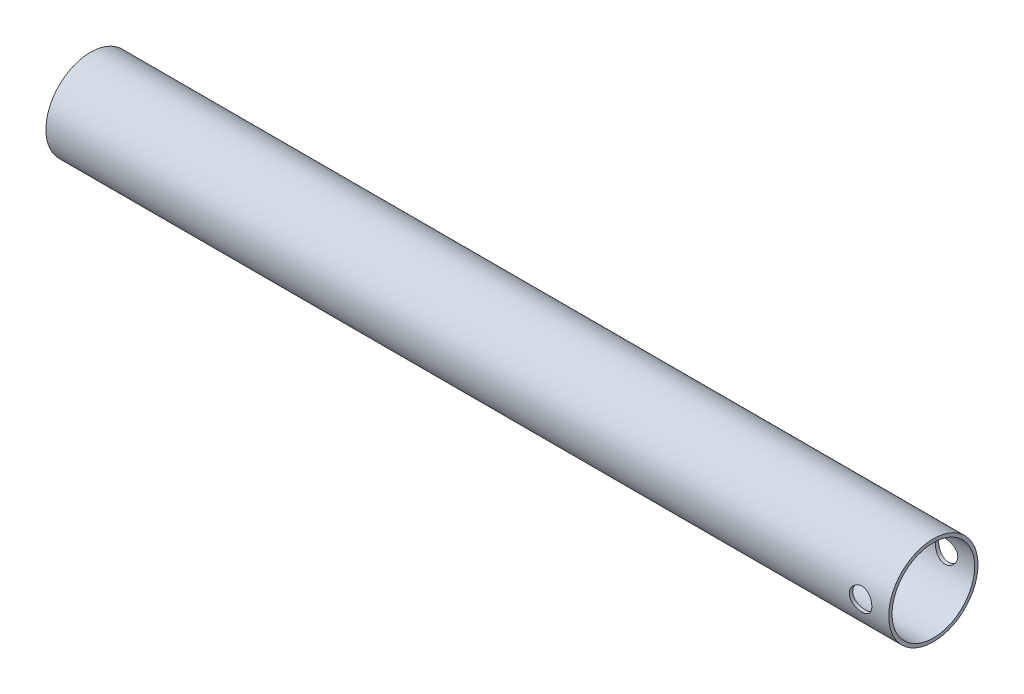
ISO-10303-21;
HEADER;
FILE_DESCRIPTION(('STEP AP214'),'2;1');
FILE_NAME('part.step','',(''),(''),'','','');
FILE_SCHEMA(('AUTOMOTIVE_DESIGN { 1 0 10303 214 1 1 1 1 }'));
ENDSEC;
DATA;
#1=APPLICATION_CONTEXT('core data for automotive mechanical design processes');
#2=APPLICATION_PROTOCOL_DEFINITION('international standard','automotive_design',2000,#1);
#3=PRODUCT_CONTEXT('',#1,'mechanical');
#4=PRODUCT('Part','Part','',(#3));
#5=PRODUCT_RELATED_PRODUCT_CATEGORY('part','',(#4));
#6=PRODUCT_DEFINITION_FORMATION('','',#4);
#7=PRODUCT_DEFINITION_CONTEXT('part definition',#1,'design');
#8=PRODUCT_DEFINITION('design','',#6,#7);
#9=PRODUCT_DEFINITION_SHAPE('','',#8);
#10=(LENGTH_UNIT() NAMED_UNIT(*) SI_UNIT(.MILLI.,.METRE.));
#11=(NAMED_UNIT(*) PLANE_ANGLE_UNIT() SI_UNIT($,.RADIAN.));
#12=(NAMED_UNIT(*) SI_UNIT($,.STERADIAN.) SOLID_ANGLE_UNIT());
#13=UNCERTAINTY_MEASURE_WITH_UNIT(LENGTH_MEASURE(1.E-05),#10,'distance_accuracy_value','');
#14=(GEOMETRIC_REPRESENTATION_CONTEXT(3) GLOBAL_UNCERTAINTY_ASSIGNED_CONTEXT((#13)) GLOBAL_UNIT_ASSIGNED_CONTEXT((#10,
#11,#12)) REPRESENTATION_CONTEXT('',''));
#15=CARTESIAN_POINT('',(0.,0.,0.));
#16=DIRECTION('',(0.,0.,1.));
#17=DIRECTION('',(1.,0.,0.));
#18=AXIS2_PLACEMENT_3D('',#15,#16,#17);
#19=CARTESIAN_POINT('',(300.,0.,0.));
#20=DIRECTION('',(1.,0.,0.));
#21=DIRECTION('',(0.,0.,-1.));
#22=AXIS2_PLACEMENT_3D('',#19,#20,#21);
#23=PLANE('',#22);
#24=CARTESIAN_POINT('',(300.,0.,0.));
#25=DIRECTION('',(1.,0.,0.));
#26=DIRECTION('',(0.,0.,-1.));
#27=AXIS2_PLACEMENT_3D('',#24,#25,#26);
#28=CIRCLE('',#27,15.9);
#29=CARTESIAN_POINT('',(300.,0.,-15.9));
#30=VERTEX_POINT('',#29);
#31=EDGE_CURVE('E10',#30,#30,#28,.T.);
#32=ORIENTED_EDGE('',*,*,#31,.T.);
#33=EDGE_LOOP('',(#32));
#34=FACE_BOUND('',#33,.T.);
#35=CARTESIAN_POINT('',(300.,0.,0.));
#36=DIRECTION('',(1.,0.,0.));
#37=DIRECTION('',(0.,0.,-1.));
#38=AXIS2_PLACEMENT_3D('',#35,#36,#37);
#39=CIRCLE('',#38,14.7);
#40=CARTESIAN_POINT('',(300.,0.,-14.7));
#41=VERTEX_POINT('',#40);
#42=EDGE_CURVE('E48',#41,#41,#39,.T.);
#43=ORIENTED_EDGE('',*,*,#42,.F.);
#44=EDGE_LOOP('',(#43));
#45=FACE_BOUND('',#44,.T.);
#46=ADVANCED_FACE('F30',(#34,#45),#23,.T.);
#47=CARTESIAN_POINT('',(0.,0.,0.));
#48=DIRECTION('',(1.,0.,0.));
#49=DIRECTION('',(0.,0.,-1.));
#50=AXIS2_PLACEMENT_3D('',#47,#48,#49);
#51=PLANE('',#50);
#52=CARTESIAN_POINT('',(0.,0.,0.));
#53=DIRECTION('',(1.,0.,0.));
#54=DIRECTION('',(0.,0.,-1.));
#55=AXIS2_PLACEMENT_3D('',#52,#53,#54);
#56=CIRCLE('',#55,15.9);
#57=CARTESIAN_POINT('',(0.,0.,-15.9));
#58=VERTEX_POINT('',#57);
#59=EDGE_CURVE('E43',#58,#58,#56,.T.);
#60=ORIENTED_EDGE('',*,*,#59,.F.);
#61=EDGE_LOOP('',(#60));
#62=FACE_BOUND('',#61,.T.);
#63=CARTESIAN_POINT('',(0.,0.,0.));
#64=DIRECTION('',(1.,0.,0.));
#65=DIRECTION('',(0.,0.,-1.));
#66=AXIS2_PLACEMENT_3D('',#63,#64,#65);
#67=CIRCLE('',#66,14.7);
#68=CARTESIAN_POINT('',(0.,0.,-14.7));
#69=VERTEX_POINT('',#68);
#70=EDGE_CURVE('E51',#69,#69,#67,.T.);
#71=ORIENTED_EDGE('',*,*,#70,.T.);
#72=EDGE_LOOP('',(#71));
#73=FACE_BOUND('',#72,.T.);
#74=ADVANCED_FACE('F84',(#62,#73),#51,.F.);
#75=CARTESIAN_POINT('',(300.,0.,0.));
#76=DIRECTION('',(-1.,0.,0.));
#77=DIRECTION('',(0.,0.,1.));
#78=AXIS2_PLACEMENT_3D('',#75,#76,#77);
#79=CYLINDRICAL_SURFACE('',#78,15.9);
#80=CARTESIAN_POINT('',(286.,0.,15.9));
#81=CARTESIAN_POINT('',(286.000006118399,0.220957554512235,15.8999962947172));
#82=CARTESIAN_POINT('',(286.018369910836,0.441983185971123,15.8953482917505));
#83=CARTESIAN_POINT('',(286.091228031371,0.877696858584048,15.8772569631423));
#84=CARTESIAN_POINT('',(286.145742552705,1.09238128759306,15.8638087218796));
#85=CARTESIAN_POINT('',(286.289040016768,1.5090577950041,15.82960565241));
#86=CARTESIAN_POINT('',(286.377781527225,1.71106487707809,15.8088596608969));
#87=CARTESIAN_POINT('',(286.586867440948,2.09732531569482,15.7622689876934));
#88=CARTESIAN_POINT('',(286.707213007556,2.28157801835896,15.7364241183223));
#89=CARTESIAN_POINT('',(286.9787392714,2.63093845422642,15.681837993207));
#90=CARTESIAN_POINT('',(287.130454665254,2.79562358369429,15.6530516007627));
#91=CARTESIAN_POINT('',(287.459269318003,3.09750066617808,15.5961257740108));
#92=CARTESIAN_POINT('',(287.636371474471,3.23468947654948,15.5679864139796));
#93=CARTESIAN_POINT('',(288.014222162792,3.4796738743176,15.5150850221248));
#94=CARTESIAN_POINT('',(288.215286748902,3.58699548849177,15.490380259719));
#95=CARTESIAN_POINT('',(288.633325676538,3.76615052950105,15.4478039743712));
#96=CARTESIAN_POINT('',(288.850297432628,3.83798970877451,15.4299313439053));
#97=CARTESIAN_POINT('',(289.289341649191,3.94269655191518,15.4035070201961));
#98=CARTESIAN_POINT('',(289.511221569615,3.9763246541123,15.3947737343424));
#99=CARTESIAN_POINT('',(289.957632290625,4.00602360838368,15.3870734521062));
#100=CARTESIAN_POINT('',(290.182162648045,4.00210065276621,15.3881048454915));
#101=CARTESIAN_POINT('',(290.62166271997,3.95741529373597,15.3996542142715));
#102=CARTESIAN_POINT('',(290.836731797271,3.91756031863234,15.4099385036396));
#103=CARTESIAN_POINT('',(291.25702858245,3.80359033873951,15.4384623077553));
#104=CARTESIAN_POINT('',(291.462255580172,3.72947286582518,15.4567023955996));
#105=CARTESIAN_POINT('',(291.859469555044,3.54831163200673,15.4992962598328));
#106=CARTESIAN_POINT('',(292.051300043574,3.44093957445725,15.5237105273324));
#107=CARTESIAN_POINT('',(292.414545566813,3.19654662066624,15.5758678783402));
#108=CARTESIAN_POINT('',(292.585956979308,3.05952047608871,15.6036115507162));
#109=CARTESIAN_POINT('',(292.908697306122,2.75501421349551,15.6602846032159));
#110=CARTESIAN_POINT('',(293.059303018575,2.58676868190967,15.6892250833306));
#111=CARTESIAN_POINT('',(293.330300659514,2.22706189643265,15.7443085259953));
#112=CARTESIAN_POINT('',(293.450691642027,2.03559991595097,15.7704514009422));
#113=CARTESIAN_POINT('',(293.658112749883,1.63385517337632,15.817126845507));
#114=CARTESIAN_POINT('',(293.745024174175,1.42350864724311,15.8376393803392));
#115=CARTESIAN_POINT('',(293.882050928688,0.990559575575081,15.87059732009));
#116=CARTESIAN_POINT('',(293.932173388952,0.767959413903615,15.8830442881357));
#117=CARTESIAN_POINT('',(293.993092095537,0.323004093264367,15.8982368765737));
#118=CARTESIAN_POINT('',(294.004873048667,0.100791843709804,15.9012253582003));
#119=CARTESIAN_POINT('',(293.99147682012,-0.342429542666543,15.8978565660392));
#120=CARTESIAN_POINT('',(293.966303010113,-0.56343878740127,15.8915001448595));
#121=CARTESIAN_POINT('',(293.880523158215,-0.994550205946391,15.8703115107032));
#122=CARTESIAN_POINT('',(293.820455422177,-1.20476639540026,15.8556081421907));
#123=CARTESIAN_POINT('',(293.667208628548,-1.61212676307624,15.8193837749175));
#124=CARTESIAN_POINT('',(293.574026202809,-1.80926960916645,15.7978620826784));
#125=CARTESIAN_POINT('',(293.35529428717,-2.188796521918,15.7498078804348));
#126=CARTESIAN_POINT('',(293.229194720389,-2.37085281669064,15.7231924903257));
#127=CARTESIAN_POINT('',(292.948910070762,-2.7115699515604,15.6680320609865));
#128=CARTESIAN_POINT('',(292.794720076449,-2.87022669157325,15.6394866848579));
#129=CARTESIAN_POINT('',(292.458057178754,-3.16370740318631,15.5828075146996));
#130=CARTESIAN_POINT('',(292.274976064567,-3.2978402387925,15.554701628863));
#131=CARTESIAN_POINT('',(291.888323647918,-3.53347994876148,15.5028749752319));
#132=CARTESIAN_POINT('',(291.684753252698,-3.63498826686436,15.4791540134102));
#133=CARTESIAN_POINT('',(291.263987593398,-3.80174014170283,15.4390456471267));
#134=CARTESIAN_POINT('',(291.046881781464,-3.86719844904057,15.4226149310886));
#135=CARTESIAN_POINT('',(290.604269275028,-3.96055347596789,15.3989083891629));
#136=CARTESIAN_POINT('',(290.378764456941,-3.98845853418225,15.3916305309247));
#137=CARTESIAN_POINT('',(289.932792050098,-4.00547511795676,15.3872100182034));
#138=CARTESIAN_POINT('',(289.712368822747,-3.99569183629733,15.3897786102138));
#139=CARTESIAN_POINT('',(289.276423421322,-3.94014201241584,15.4040932010133));
#140=CARTESIAN_POINT('',(289.060901146429,-3.89437621108365,15.4158390108408));
#141=CARTESIAN_POINT('',(288.64209457103,-3.76876759162776,15.4470226155431));
#142=CARTESIAN_POINT('',(288.438743585788,-3.68913453615028,15.4664130092882));
#143=CARTESIAN_POINT('',(288.048142340273,-3.49821751506907,15.5107071042047));
#144=CARTESIAN_POINT('',(287.860894345759,-3.38692910488054,15.5356115794745));
#145=CARTESIAN_POINT('',(287.502479715071,-3.13240618442289,15.5889490823253));
#146=CARTESIAN_POINT('',(287.331868022299,-2.98840596993518,15.6174578969873));
#147=CARTESIAN_POINT('',(287.01687091385,-2.67403594078357,15.6743421724415));
#148=CARTESIAN_POINT('',(286.872491747093,-2.50365986090833,15.7027175998951));
#149=CARTESIAN_POINT('',(286.611465364458,-2.1375901636078,15.7567612266969));
#150=CARTESIAN_POINT('',(286.495377402805,-1.94148832531207,15.7823699943067));
#151=CARTESIAN_POINT('',(286.298000573896,-1.53192485252501,15.8273658654756));
#152=CARTESIAN_POINT('',(286.216687006874,-1.31847566828181,15.8467573826022));
#153=CARTESIAN_POINT('',(286.103103701272,-0.921203411811069,15.8742998097677));
#154=CARTESIAN_POINT('',(286.06452394783,-0.739256985702941,15.883870815249));
#155=CARTESIAN_POINT('',(286.012970513009,-0.371556222208906,15.8967222254535));
#156=CARTESIAN_POINT('',(285.999994855067,-0.185802179878715,15.9000031157551));
#157=CARTESIAN_POINT('',(286.,0.,15.9));
#158=B_SPLINE_CURVE_WITH_KNOTS('',3,(#80,#81,#82,#83,#84,#85,#86,#87,#88,#89,#90,#91,#92,#93,
#94,#95,#96,#97,#98,#99,#100,#101,#102,#103,#104,#105,#106,#107,#108,#109,#110,#111,#112,#113,
#114,#115,#116,#117,#118,#119,#120,#121,#122,#123,#124,#125,#126,#127,#128,#129,#130,#131,#132,
#133,#134,#135,#136,#137,#138,#139,#140,#141,#142,#143,#144,#145,#146,#147,#148,#149,#150,#151,
#152,#153,#154,#155,#156,#157),.UNSPECIFIED.,.T.,.F.,(4,2,2,2,2,2,2,2,2,2,2,2,2,2,2,2,2,2,2,2,2,
2,2,2,2,2,2,2,2,2,2,2,2,2,2,2,2,2,4),(0.,0.66219172220286,1.32475364635815,1.98651603419136,
2.64830278485941,3.32246905207587,3.99671232808247,4.68111365698529,5.3654039937937,
6.03582371832577,6.70613289007121,7.35997410678294,8.01386243078649,8.67442373967603,
9.33510205392415,10.0148663297268,10.6946518851751,11.3768258967888,12.0588676618027,
12.7232486207365,13.3875689668111,14.0419032449877,14.6963040956095,15.3624314133388,
16.0286753119873,16.7114946429602,17.3942837528141,18.0729602228943,18.7514859693261,
19.4102678713326,20.0690362091961,20.723782448338,21.3786206628467,22.050743862004,
22.7230269601224,23.4076822098771,24.0918503476029,24.6487272778237,25.2055612170594),.UNSPECIFIED.);
#159=CARTESIAN_POINT('',(286.,0.,15.9));
#160=VERTEX_POINT('',#159);
#161=EDGE_CURVE('E74',#160,#160,#158,.T.);
#162=ORIENTED_EDGE('',*,*,#161,.T.);
#163=EDGE_LOOP('',(#162));
#164=FACE_BOUND('',#163,.T.);
#165=CARTESIAN_POINT('',(286.,0.,-15.9));
#166=CARTESIAN_POINT('',(286.000006118399,-0.220957554512235,-15.8999962947172));
#167=CARTESIAN_POINT('',(286.018369910836,-0.441983185971123,-15.8953482917505));
#168=CARTESIAN_POINT('',(286.091228031371,-0.877696858584048,-15.8772569631423));
#169=CARTESIAN_POINT('',(286.145742552705,-1.09238128759306,-15.8638087218796));
#170=CARTESIAN_POINT('',(286.289040016768,-1.5090577950041,-15.82960565241));
#171=CARTESIAN_POINT('',(286.377781527225,-1.71106487707809,-15.8088596608969));
#172=CARTESIAN_POINT('',(286.586867440948,-2.09732531569482,-15.7622689876934));
#173=CARTESIAN_POINT('',(286.707213007556,-2.28157801835896,-15.7364241183223));
#174=CARTESIAN_POINT('',(286.9787392714,-2.63093845422642,-15.681837993207));
#175=CARTESIAN_POINT('',(287.130454665254,-2.79562358369429,-15.6530516007627));
#176=CARTESIAN_POINT('',(287.459269318003,-3.09750066617808,-15.5961257740108));
#177=CARTESIAN_POINT('',(287.636371474471,-3.23468947654948,-15.5679864139796));
#178=CARTESIAN_POINT('',(288.014222162792,-3.4796738743176,-15.5150850221248));
#179=CARTESIAN_POINT('',(288.215286748902,-3.58699548849177,-15.490380259719));
#180=CARTESIAN_POINT('',(288.633325676538,-3.76615052950105,-15.4478039743712));
#181=CARTESIAN_POINT('',(288.850297432628,-3.83798970877451,-15.4299313439053));
#182=CARTESIAN_POINT('',(289.289341649191,-3.94269655191518,-15.4035070201961));
#183=CARTESIAN_POINT('',(289.511221569615,-3.9763246541123,-15.3947737343424));
#184=CARTESIAN_POINT('',(289.957632290625,-4.00602360838368,-15.3870734521062));
#185=CARTESIAN_POINT('',(290.182162648045,-4.00210065276621,-15.3881048454915));
#186=CARTESIAN_POINT('',(290.62166271997,-3.95741529373597,-15.3996542142715));
#187=CARTESIAN_POINT('',(290.836731797271,-3.91756031863234,-15.4099385036396));
#188=CARTESIAN_POINT('',(291.25702858245,-3.80359033873951,-15.4384623077553));
#189=CARTESIAN_POINT('',(291.462255580172,-3.72947286582518,-15.4567023955996));
#190=CARTESIAN_POINT('',(291.859469555044,-3.54831163200673,-15.4992962598328));
#191=CARTESIAN_POINT('',(292.051300043574,-3.44093957445725,-15.5237105273324));
#192=CARTESIAN_POINT('',(292.414545566813,-3.19654662066624,-15.5758678783402));
#193=CARTESIAN_POINT('',(292.585956979308,-3.05952047608871,-15.6036115507162));
#194=CARTESIAN_POINT('',(292.908697306122,-2.75501421349551,-15.6602846032159));
#195=CARTESIAN_POINT('',(293.059303018575,-2.58676868190967,-15.6892250833306));
#196=CARTESIAN_POINT('',(293.330300659514,-2.22706189643265,-15.7443085259953));
#197=CARTESIAN_POINT('',(293.450691642027,-2.03559991595097,-15.7704514009422));
#198=CARTESIAN_POINT('',(293.658112749883,-1.63385517337632,-15.817126845507));
#199=CARTESIAN_POINT('',(293.745024174175,-1.42350864724311,-15.8376393803392));
#200=CARTESIAN_POINT('',(293.882050928688,-0.990559575575081,-15.87059732009));
#201=CARTESIAN_POINT('',(293.932173388952,-0.767959413903615,-15.8830442881357));
#202=CARTESIAN_POINT('',(293.993092095537,-0.323004093264367,-15.8982368765737));
#203=CARTESIAN_POINT('',(294.004873048667,-0.100791843709804,-15.9012253582003));
#204=CARTESIAN_POINT('',(293.99147682012,0.342429542666543,-15.8978565660392));
#205=CARTESIAN_POINT('',(293.966303010113,0.56343878740127,-15.8915001448595));
#206=CARTESIAN_POINT('',(293.880523158215,0.994550205946391,-15.8703115107032));
#207=CARTESIAN_POINT('',(293.820455422177,1.20476639540026,-15.8556081421907));
#208=CARTESIAN_POINT('',(293.667208628548,1.61212676307624,-15.8193837749175));
#209=CARTESIAN_POINT('',(293.574026202809,1.80926960916645,-15.7978620826784));
#210=CARTESIAN_POINT('',(293.35529428717,2.188796521918,-15.7498078804348));
#211=CARTESIAN_POINT('',(293.229194720389,2.37085281669064,-15.7231924903257));
#212=CARTESIAN_POINT('',(292.948910070762,2.7115699515604,-15.6680320609865));
#213=CARTESIAN_POINT('',(292.794720076449,2.87022669157325,-15.6394866848579));
#214=CARTESIAN_POINT('',(292.458057178754,3.16370740318631,-15.5828075146996));
#215=CARTESIAN_POINT('',(292.274976064567,3.2978402387925,-15.554701628863));
#216=CARTESIAN_POINT('',(291.888323647918,3.53347994876148,-15.5028749752319));
#217=CARTESIAN_POINT('',(291.684753252698,3.63498826686436,-15.4791540134102));
#218=CARTESIAN_POINT('',(291.263987593398,3.80174014170283,-15.4390456471267));
#219=CARTESIAN_POINT('',(291.046881781464,3.86719844904057,-15.4226149310886));
#220=CARTESIAN_POINT('',(290.604269275028,3.96055347596789,-15.3989083891629));
#221=CARTESIAN_POINT('',(290.378764456941,3.98845853418225,-15.3916305309247));
#222=CARTESIAN_POINT('',(289.932792050098,4.00547511795676,-15.3872100182034));
#223=CARTESIAN_POINT('',(289.712368822747,3.99569183629733,-15.3897786102138));
#224=CARTESIAN_POINT('',(289.276423421322,3.94014201241584,-15.4040932010133));
#225=CARTESIAN_POINT('',(289.060901146429,3.89437621108365,-15.4158390108408));
#226=CARTESIAN_POINT('',(288.64209457103,3.76876759162776,-15.4470226155431));
#227=CARTESIAN_POINT('',(288.438743585788,3.68913453615028,-15.4664130092882));
#228=CARTESIAN_POINT('',(288.048142340273,3.49821751506907,-15.5107071042047));
#229=CARTESIAN_POINT('',(287.860894345759,3.38692910488054,-15.5356115794745));
#230=CARTESIAN_POINT('',(287.502479715071,3.13240618442289,-15.5889490823253));
#231=CARTESIAN_POINT('',(287.331868022299,2.98840596993518,-15.6174578969873));
#232=CARTESIAN_POINT('',(287.01687091385,2.67403594078357,-15.6743421724415));
#233=CARTESIAN_POINT('',(286.872491747093,2.50365986090833,-15.7027175998951));
#234=CARTESIAN_POINT('',(286.611465364458,2.1375901636078,-15.7567612266969));
#235=CARTESIAN_POINT('',(286.495377402805,1.94148832531207,-15.7823699943067));
#236=CARTESIAN_POINT('',(286.298000573896,1.53192485252501,-15.8273658654756));
#237=CARTESIAN_POINT('',(286.216687006874,1.31847566828181,-15.8467573826022));
#238=CARTESIAN_POINT('',(286.103103701272,0.921203411811069,-15.8742998097677));
#239=CARTESIAN_POINT('',(286.06452394783,0.739256985702941,-15.883870815249));
#240=CARTESIAN_POINT('',(286.012970513009,0.371556222208906,-15.8967222254535));
#241=CARTESIAN_POINT('',(285.999994855067,0.185802179878715,-15.9000031157551));
#242=CARTESIAN_POINT('',(286.,0.,-15.9));
#243=B_SPLINE_CURVE_WITH_KNOTS('',3,(#165,#166,#167,#168,#169,#170,#171,#172,#173,#174,#175,
#176,#177,#178,#179,#180,#181,#182,#183,#184,#185,#186,#187,#188,#189,#190,#191,#192,#193,#194,
#195,#196,#197,#198,#199,#200,#201,#202,#203,#204,#205,#206,#207,#208,#209,#210,#211,#212,#213,
#214,#215,#216,#217,#218,#219,#220,#221,#222,#223,#224,#225,#226,#227,#228,#229,#230,#231,#232,
#233,#234,#235,#236,#237,#238,#239,#240,#241,#242),.UNSPECIFIED.,.T.,.F.,(4,2,2,2,2,2,2,2,2,2,2,
2,2,2,2,2,2,2,2,2,2,2,2,2,2,2,2,2,2,2,2,2,2,2,2,2,2,2,4),(0.,0.66219172220286,1.32475364635815,
1.98651603419136,2.64830278485941,3.32246905207587,3.99671232808247,4.68111365698529,
5.3654039937937,6.03582371832577,6.70613289007121,7.35997410678294,8.01386243078649,
8.67442373967603,9.33510205392415,10.0148663297268,10.6946518851751,11.3768258967888,
12.0588676618027,12.7232486207365,13.3875689668111,14.0419032449877,14.6963040956095,
15.3624314133388,16.0286753119873,16.7114946429602,17.3942837528141,18.0729602228943,
18.7514859693261,19.4102678713326,20.0690362091961,20.723782448338,21.3786206628467,
22.050743862004,22.7230269601224,23.4076822098771,24.0918503476029,24.6487272778237,
25.2055612170594),.UNSPECIFIED.);
#244=CARTESIAN_POINT('',(286.,0.,-15.9));
#245=VERTEX_POINT('',#244);
#246=EDGE_CURVE('E70',#245,#245,#243,.T.);
#247=ORIENTED_EDGE('',*,*,#246,.T.);
#248=EDGE_LOOP('',(#247));
#249=FACE_BOUND('',#248,.T.);
#250=ORIENTED_EDGE('',*,*,#31,.F.);
#251=EDGE_LOOP('',(#250));
#252=FACE_BOUND('',#251,.T.);
#253=ORIENTED_EDGE('',*,*,#59,.T.);
#254=EDGE_LOOP('',(#253));
#255=FACE_BOUND('',#254,.T.);
#256=ADVANCED_FACE('F32',(#164,#249,#252,#255),#79,.T.);
#257=CARTESIAN_POINT('',(300.,0.,0.));
#258=DIRECTION('',(-1.,0.,0.));
#259=DIRECTION('',(0.,0.,1.));
#260=AXIS2_PLACEMENT_3D('',#257,#258,#259);
#261=CYLINDRICAL_SURFACE('',#260,14.7);
#262=CARTESIAN_POINT('',(294.,0.,14.7));
#263=CARTESIAN_POINT('',(293.999995124268,-0.22034165658736,14.6999968512291));
#264=CARTESIAN_POINT('',(293.981732633285,-0.440734903969697,14.6949973308827));
#265=CARTESIAN_POINT('',(293.909301293039,-0.875161600437702,14.6755392059811));
#266=CARTESIAN_POINT('',(293.855116200381,-1.0891921266777,14.6610763223436));
#267=CARTESIAN_POINT('',(293.712739942408,-1.50456065186432,14.6242860028911));
#268=CARTESIAN_POINT('',(293.624593627165,-1.70591498501239,14.6019689428553));
#269=CARTESIAN_POINT('',(293.416966146293,-2.09098321747485,14.5518226467614));
#270=CARTESIAN_POINT('',(293.297482553003,-2.27469574859225,14.5239929836891));
#271=CARTESIAN_POINT('',(293.027538123027,-2.62368517290891,14.4650718560419));
#272=CARTESIAN_POINT('',(292.876463015583,-2.78847721488024,14.4339228482995));
#273=CARTESIAN_POINT('',(292.548936493407,-3.09072682736227,14.372238989948));
#274=CARTESIAN_POINT('',(292.372481672575,-3.22818072303061,14.3417042224013));
#275=CARTESIAN_POINT('',(291.995298506621,-3.47424509426229,14.2841144576796));
#276=CARTESIAN_POINT('',(291.79419076387,-3.58229252135503,14.2571318991011));
#277=CARTESIAN_POINT('',(291.375810274986,-3.76284828216771,14.2105498933679));
#278=CARTESIAN_POINT('',(291.158540655956,-3.83536347039501,14.1909490223843));
#279=CARTESIAN_POINT('',(290.719385909912,-3.94110234951749,14.1619446505942));
#280=CARTESIAN_POINT('',(290.497728472377,-3.97520749812851,14.1523128133676));
#281=CARTESIAN_POINT('',(290.051644982153,-4.00590701147063,14.1436552947599));
#282=CARTESIAN_POINT('',(289.827219478519,-4.00250869930848,14.1446275427734));
#283=CARTESIAN_POINT('',(289.388893964313,-3.95899637335051,14.1568642845443));
#284=CARTESIAN_POINT('',(289.174877774568,-3.91995463590051,14.1678281782207));
#285=CARTESIAN_POINT('',(288.756554339609,-3.80798343991935,14.1983307650305));
#286=CARTESIAN_POINT('',(288.552247900369,-3.73505117364481,14.2178701686156));
#287=CARTESIAN_POINT('',(288.156375516168,-3.55650879306046,14.2635826265615));
#288=CARTESIAN_POINT('',(287.96498610553,-3.45052721043659,14.289830444627));
#289=CARTESIAN_POINT('',(287.602333931613,-3.20915358935706,14.3459627457329));
#290=CARTESIAN_POINT('',(287.4310752879,-3.07375554719863,14.3758479705953));
#291=CARTESIAN_POINT('',(287.107426307853,-2.77193425543227,14.4371340644815));
#292=CARTESIAN_POINT('',(286.955876207444,-2.60461214102699,14.4685519055698));
#293=CARTESIAN_POINT('',(286.682811044548,-2.2465423733215,14.5284531101248));
#294=CARTESIAN_POINT('',(286.561297264405,-2.05579372039117,14.5569363482741));
#295=CARTESIAN_POINT('',(286.351362848026,-1.65494937035105,14.6079464064186));
#296=CARTESIAN_POINT('',(286.263099583223,-1.44476739205996,14.6304447566901));
#297=CARTESIAN_POINT('',(286.123405753689,-1.01179504921,14.6667445456044));
#298=CARTESIAN_POINT('',(286.071966797223,-0.789007569759485,14.6805479656113));
#299=CARTESIAN_POINT('',(286.008713349824,-0.344314695631096,14.6976008197969));
#300=CARTESIAN_POINT('',(285.995757086146,-0.122583119592541,14.7011542731524));
#301=CARTESIAN_POINT('',(286.00667632403,0.319886549937458,14.6981836676835));
#302=CARTESIAN_POINT('',(286.030547849364,0.540624748101485,14.691660696792));
#303=CARTESIAN_POINT('',(286.113510333917,0.970730057096065,14.6694670103247));
#304=CARTESIAN_POINT('',(286.171959720725,1.18023031771101,14.6539630385283));
#305=CARTESIAN_POINT('',(286.32166957244,1.58642810264195,14.615570630465));
#306=CARTESIAN_POINT('',(286.412933665515,1.78312420842185,14.5926813776712));
#307=CARTESIAN_POINT('',(286.627768270859,2.16253031248185,14.5413507234933));
#308=CARTESIAN_POINT('',(286.751953672523,2.34487788463551,14.5128065829583));
#309=CARTESIAN_POINT('',(287.028336924402,2.68654487131906,14.4534631989487));
#310=CARTESIAN_POINT('',(287.180540543609,2.8458595312556,14.4226634918376));
#311=CARTESIAN_POINT('',(287.513975529462,3.14178453317265,14.3611538413901));
#312=CARTESIAN_POINT('',(287.695929813317,3.27758796841782,14.3304732596337));
#313=CARTESIAN_POINT('',(288.080697924671,3.51675723456453,14.2736675818546));
#314=CARTESIAN_POINT('',(288.283510913079,3.62012436961539,14.2475423026979));
#315=CARTESIAN_POINT('',(288.703266948263,3.79071190058102,14.2031080491056));
#316=CARTESIAN_POINT('',(288.920121509878,3.85813785143671,14.1847547520076));
#317=CARTESIAN_POINT('',(289.362678615698,3.95539045574915,14.1579475779791));
#318=CARTESIAN_POINT('',(289.588378767365,3.98522720486916,14.1494910430314));
#319=CARTESIAN_POINT('',(290.033941198034,4.00585638499974,14.1436633257882));
#320=CARTESIAN_POINT('',(290.253739363615,3.99794838782493,14.1459231556394));
#321=CARTESIAN_POINT('',(290.688741299534,3.94634076852443,14.160405991764));
#322=CARTESIAN_POINT('',(290.903945197324,3.90264214061042,14.1726287212825));
#323=CARTESIAN_POINT('',(291.321938338235,3.78146129092509,14.2054359682043));
#324=CARTESIAN_POINT('',(291.524816481549,3.70426515798633,14.2259495769336));
#325=CARTESIAN_POINT('',(291.914897335887,3.51850223825882,14.2730263900661));
#326=CARTESIAN_POINT('',(292.102097490197,3.4099303476158,14.2995905785603));
#327=CARTESIAN_POINT('',(292.461685178794,3.16060471336106,14.3567888341409));
#328=CARTESIAN_POINT('',(292.633445624486,3.01896929183698,14.3875224294891));
#329=CARTESIAN_POINT('',(292.951183152672,2.70919982462503,14.4490529315273));
#330=CARTESIAN_POINT('',(293.097153898378,2.54105928551412,14.4798498519016));
#331=CARTESIAN_POINT('',(293.362412234823,2.1784777852975,14.538867979568));
#332=CARTESIAN_POINT('',(293.481023812118,1.98352920353101,14.5670154344688));
#333=CARTESIAN_POINT('',(293.683605054193,1.57569729668244,14.6167455792695));
#334=CARTESIAN_POINT('',(293.767596041018,1.36282510793638,14.638332307615));
#335=CARTESIAN_POINT('',(293.888119849001,0.959079649876184,14.6698556348187));
#336=CARTESIAN_POINT('',(293.929975055281,0.76987867019601,14.6810757365139));
#337=CARTESIAN_POINT('',(293.985915775929,0.38713142063101,14.6961489052563));
#338=CARTESIAN_POINT('',(294.000004283673,0.193585621412947,14.7000027664164));
#339=CARTESIAN_POINT('',(294.,0.,14.7));
#340=B_SPLINE_CURVE_WITH_KNOTS('',3,(#262,#263,#264,#265,#266,#267,#268,#269,#270,#271,#272,
#273,#274,#275,#276,#277,#278,#279,#280,#281,#282,#283,#284,#285,#286,#287,#288,#289,#290,#291,
#292,#293,#294,#295,#296,#297,#298,#299,#300,#301,#302,#303,#304,#305,#306,#307,#308,#309,#310,
#311,#312,#313,#314,#315,#316,#317,#318,#319,#320,#321,#322,#323,#324,#325,#326,#327,#328,#329,
#330,#331,#332,#333,#334,#335,#336,#337,#338,#339),.UNSPECIFIED.,.T.,.F.,(4,2,2,2,2,2,2,2,2,2,2,
2,2,2,2,2,2,2,2,2,2,2,2,2,2,2,2,2,2,2,2,2,2,2,2,2,2,2,4),(0.,0.660314864524289,1.32092851246981,
1.98067271085434,2.64046803396347,3.31453816103895,3.98869883667368,4.67498107343796,
5.36113086764835,6.03119143591694,6.70112116724056,7.35153830832175,8.00200934440424,
8.66007243569967,9.31826995965261,9.99886212662595,10.6794833451365,11.3632865717292,
12.0469339197027,12.710084311142,13.373163108466,14.0243085416855,14.6755259911228,
15.3398875466648,16.0043860485309,16.688455906807,17.3724982575201,18.0525852754198,
18.7324895973868,19.3891567285372,20.0458056190479,20.6969534354608,21.348207232934,
22.0193530796867,22.6906636050641,23.3771138337034,24.0631406590992,24.6433361971493,
25.2234691840612),.UNSPECIFIED.);
#341=CARTESIAN_POINT('',(294.,0.,14.7));
#342=VERTEX_POINT('',#341);
#343=EDGE_CURVE('E35',#342,#342,#340,.T.);
#344=ORIENTED_EDGE('',*,*,#343,.F.);
#345=EDGE_LOOP('',(#344));
#346=FACE_BOUND('',#345,.T.);
#347=CARTESIAN_POINT('',(286.,0.,-14.7));
#348=CARTESIAN_POINT('',(286.000004875732,-0.22034165658736,-14.6999968512291));
#349=CARTESIAN_POINT('',(286.018267366715,-0.440734903969697,-14.6949973308827));
#350=CARTESIAN_POINT('',(286.090698706961,-0.875161600437702,-14.6755392059811));
#351=CARTESIAN_POINT('',(286.144883799619,-1.0891921266777,-14.6610763223436));
#352=CARTESIAN_POINT('',(286.287260057592,-1.50456065186432,-14.6242860028911));
#353=CARTESIAN_POINT('',(286.375406372835,-1.70591498501239,-14.6019689428553));
#354=CARTESIAN_POINT('',(286.583033853706,-2.09098321747485,-14.5518226467614));
#355=CARTESIAN_POINT('',(286.702517446997,-2.27469574859225,-14.5239929836891));
#356=CARTESIAN_POINT('',(286.972461876973,-2.62368517290891,-14.4650718560419));
#357=CARTESIAN_POINT('',(287.123536984417,-2.78847721488024,-14.4339228482995));
#358=CARTESIAN_POINT('',(287.451063506593,-3.09072682736227,-14.372238989948));
#359=CARTESIAN_POINT('',(287.627518327425,-3.22818072303061,-14.3417042224013));
#360=CARTESIAN_POINT('',(288.004701493379,-3.47424509426229,-14.2841144576796));
#361=CARTESIAN_POINT('',(288.20580923613,-3.58229252135503,-14.2571318991011));
#362=CARTESIAN_POINT('',(288.624189725013,-3.76284828216771,-14.2105498933679));
#363=CARTESIAN_POINT('',(288.841459344044,-3.83536347039501,-14.1909490223843));
#364=CARTESIAN_POINT('',(289.280614090088,-3.94110234951749,-14.1619446505942));
#365=CARTESIAN_POINT('',(289.502271527623,-3.97520749812851,-14.1523128133676));
#366=CARTESIAN_POINT('',(289.948355017847,-4.00590701147063,-14.1436552947599));
#367=CARTESIAN_POINT('',(290.172780521481,-4.00250869930848,-14.1446275427734));
#368=CARTESIAN_POINT('',(290.611106035687,-3.95899637335051,-14.1568642845443));
#369=CARTESIAN_POINT('',(290.825122225432,-3.91995463590051,-14.1678281782207));
#370=CARTESIAN_POINT('',(291.243445660391,-3.80798343991935,-14.1983307650305));
#371=CARTESIAN_POINT('',(291.447752099631,-3.73505117364481,-14.2178701686156));
#372=CARTESIAN_POINT('',(291.843624483832,-3.55650879306046,-14.2635826265615));
#373=CARTESIAN_POINT('',(292.035013894469,-3.45052721043659,-14.289830444627));
#374=CARTESIAN_POINT('',(292.397666068387,-3.20915358935706,-14.3459627457329));
#375=CARTESIAN_POINT('',(292.568924712099,-3.07375554719863,-14.3758479705953));
#376=CARTESIAN_POINT('',(292.892573692147,-2.77193425543227,-14.4371340644815));
#377=CARTESIAN_POINT('',(293.044123792556,-2.60461214102699,-14.4685519055698));
#378=CARTESIAN_POINT('',(293.317188955451,-2.2465423733215,-14.5284531101248));
#379=CARTESIAN_POINT('',(293.438702735595,-2.05579372039117,-14.5569363482741));
#380=CARTESIAN_POINT('',(293.648637151974,-1.65494937035106,-14.6079464064186));
#381=CARTESIAN_POINT('',(293.736900416776,-1.44476739205997,-14.6304447566901));
#382=CARTESIAN_POINT('',(293.876594246311,-1.01179504921001,-14.6667445456044));
#383=CARTESIAN_POINT('',(293.928033202777,-0.78900756975949,-14.6805479656113));
#384=CARTESIAN_POINT('',(293.991286650176,-0.344314695631096,-14.6976008197969));
#385=CARTESIAN_POINT('',(294.004242913854,-0.122583119592542,-14.7011542731524));
#386=CARTESIAN_POINT('',(293.99332367597,0.319886549937457,-14.6981836676835));
#387=CARTESIAN_POINT('',(293.969452150636,0.540624748101485,-14.691660696792));
#388=CARTESIAN_POINT('',(293.886489666083,0.970730057096065,-14.6694670103247));
#389=CARTESIAN_POINT('',(293.828040279275,1.18023031771101,-14.6539630385283));
#390=CARTESIAN_POINT('',(293.67833042756,1.58642810264195,-14.615570630465));
#391=CARTESIAN_POINT('',(293.587066334485,1.78312420842185,-14.5926813776712));
#392=CARTESIAN_POINT('',(293.372231729141,2.16253031248185,-14.5413507234933));
#393=CARTESIAN_POINT('',(293.248046327477,2.34487788463551,-14.5128065829583));
#394=CARTESIAN_POINT('',(292.971663075598,2.68654487131906,-14.4534631989487));
#395=CARTESIAN_POINT('',(292.819459456391,2.8458595312556,-14.4226634918376));
#396=CARTESIAN_POINT('',(292.486024470538,3.14178453317265,-14.3611538413901));
#397=CARTESIAN_POINT('',(292.304070186683,3.27758796841782,-14.3304732596337));
#398=CARTESIAN_POINT('',(291.919302075329,3.51675723456453,-14.2736675818546));
#399=CARTESIAN_POINT('',(291.716489086921,3.62012436961539,-14.2475423026979));
#400=CARTESIAN_POINT('',(291.296733051737,3.79071190058101,-14.2031080491056));
#401=CARTESIAN_POINT('',(291.079878490122,3.85813785143669,-14.1847547520076));
#402=CARTESIAN_POINT('',(290.637321384302,3.95539045574914,-14.1579475779791));
#403=CARTESIAN_POINT('',(290.411621232635,3.98522720486916,-14.1494910430314));
#404=CARTESIAN_POINT('',(289.966058801966,4.00585638499974,-14.1436633257882));
#405=CARTESIAN_POINT('',(289.746260636385,3.99794838782493,-14.1459231556394));
#406=CARTESIAN_POINT('',(289.311258700466,3.94634076852443,-14.160405991764));
#407=CARTESIAN_POINT('',(289.096054802676,3.90264214061042,-14.1726287212825));
#408=CARTESIAN_POINT('',(288.678061661765,3.78146129092509,-14.2054359682043));
#409=CARTESIAN_POINT('',(288.475183518451,3.70426515798633,-14.2259495769336));
#410=CARTESIAN_POINT('',(288.085102664113,3.51850223825882,-14.2730263900661));
#411=CARTESIAN_POINT('',(287.897902509803,3.4099303476158,-14.2995905785603));
#412=CARTESIAN_POINT('',(287.538314821206,3.16060471336106,-14.3567888341409));
#413=CARTESIAN_POINT('',(287.366554375514,3.01896929183696,-14.3875224294891));
#414=CARTESIAN_POINT('',(287.048816847328,2.70919982462501,-14.4490529315273));
#415=CARTESIAN_POINT('',(286.902846101622,2.54105928551411,-14.4798498519016));
#416=CARTESIAN_POINT('',(286.637587765177,2.17847778529751,-14.538867979568));
#417=CARTESIAN_POINT('',(286.518976187882,1.98352920353101,-14.5670154344688));
#418=CARTESIAN_POINT('',(286.316394945807,1.57569729668244,-14.6167455792695));
#419=CARTESIAN_POINT('',(286.232403958981,1.36282510793638,-14.638332307615));
#420=CARTESIAN_POINT('',(286.111880150999,0.959079649876189,-14.6698556348187));
#421=CARTESIAN_POINT('',(286.070024944719,0.769878670196021,-14.6810757365139));
#422=CARTESIAN_POINT('',(286.014084224071,0.38713142063102,-14.6961489052563));
#423=CARTESIAN_POINT('',(285.999995716327,0.193585621412953,-14.7000027664164));
#424=CARTESIAN_POINT('',(286.,0.,-14.7));
#425=B_SPLINE_CURVE_WITH_KNOTS('',3,(#347,#348,#349,#350,#351,#352,#353,#354,#355,#356,#357,
#358,#359,#360,#361,#362,#363,#364,#365,#366,#367,#368,#369,#370,#371,#372,#373,#374,#375,#376,
#377,#378,#379,#380,#381,#382,#383,#384,#385,#386,#387,#388,#389,#390,#391,#392,#393,#394,#395,
#396,#397,#398,#399,#400,#401,#402,#403,#404,#405,#406,#407,#408,#409,#410,#411,#412,#413,#414,
#415,#416,#417,#418,#419,#420,#421,#422,#423,#424),.UNSPECIFIED.,.T.,.F.,(4,2,2,2,2,2,2,2,2,2,2,
2,2,2,2,2,2,2,2,2,2,2,2,2,2,2,2,2,2,2,2,2,2,2,2,2,2,2,4),(0.,0.660314864524289,1.32092851246981,
1.98067271085434,2.64046803396347,3.31453816103895,3.98869883667368,4.67498107343796,
5.36113086764835,6.03119143591694,6.70112116724056,7.35153830832175,8.00200934440424,
8.66007243569967,9.31826995965261,9.99886212662595,10.6794833451365,11.3632865717292,
12.0469339197027,12.710084311142,13.373163108466,14.0243085416855,14.6755259911228,
15.3398875466648,16.0043860485309,16.688455906807,17.3724982575201,18.0525852754197,
18.7324895973868,19.3891567285372,20.0458056190479,20.6969534354608,21.348207232934,
22.0193530796867,22.6906636050641,23.3771138337034,24.0631406590992,24.6433361971493,
25.2234691840612),.UNSPECIFIED.);
#426=CARTESIAN_POINT('',(286.,0.,-14.7));
#427=VERTEX_POINT('',#426);
#428=EDGE_CURVE('E53',#427,#427,#425,.T.);
#429=ORIENTED_EDGE('',*,*,#428,.F.);
#430=EDGE_LOOP('',(#429));
#431=FACE_BOUND('',#430,.T.);
#432=ORIENTED_EDGE('',*,*,#42,.T.);
#433=EDGE_LOOP('',(#432));
#434=FACE_BOUND('',#433,.T.);
#435=ORIENTED_EDGE('',*,*,#70,.F.);
#436=EDGE_LOOP('',(#435));
#437=FACE_BOUND('',#436,.T.);
#438=ADVANCED_FACE('F57',(#346,#431,#434,#437),#261,.F.);
#439=CARTESIAN_POINT('',(290.,0.,15.9));
#440=DIRECTION('',(0.,0.,-1.));
#441=DIRECTION('',(-1.,0.,0.));
#442=AXIS2_PLACEMENT_3D('',#439,#440,#441);
#443=CYLINDRICAL_SURFACE('',#442,3.99999999999999);
#444=ORIENTED_EDGE('',*,*,#428,.T.);
#445=EDGE_LOOP('',(#444));
#446=FACE_BOUND('',#445,.T.);
#447=ORIENTED_EDGE('',*,*,#246,.F.);
#448=EDGE_LOOP('',(#447));
#449=FACE_BOUND('',#448,.T.);
#450=ADVANCED_FACE('F63',(#446,#449),#443,.F.);
#451=ORIENTED_EDGE('',*,*,#343,.T.);
#452=EDGE_LOOP('',(#451));
#453=FACE_BOUND('',#452,.T.);
#454=ORIENTED_EDGE('',*,*,#161,.F.);
#455=EDGE_LOOP('',(#454));
#456=FACE_BOUND('',#455,.T.);
#457=ADVANCED_FACE('F60',(#453,#456),#443,.F.);
#458=CLOSED_SHELL('',(#46,#74,#256,#438,#450,#457));
#459=MANIFOLD_SOLID_BREP('B2',#458);
#460=ADVANCED_BREP_SHAPE_REPRESENTATION('',(#18,#459),#14);
#461=SHAPE_DEFINITION_REPRESENTATION(#9,#460);
ENDSEC;
END-ISO-10303-21;
